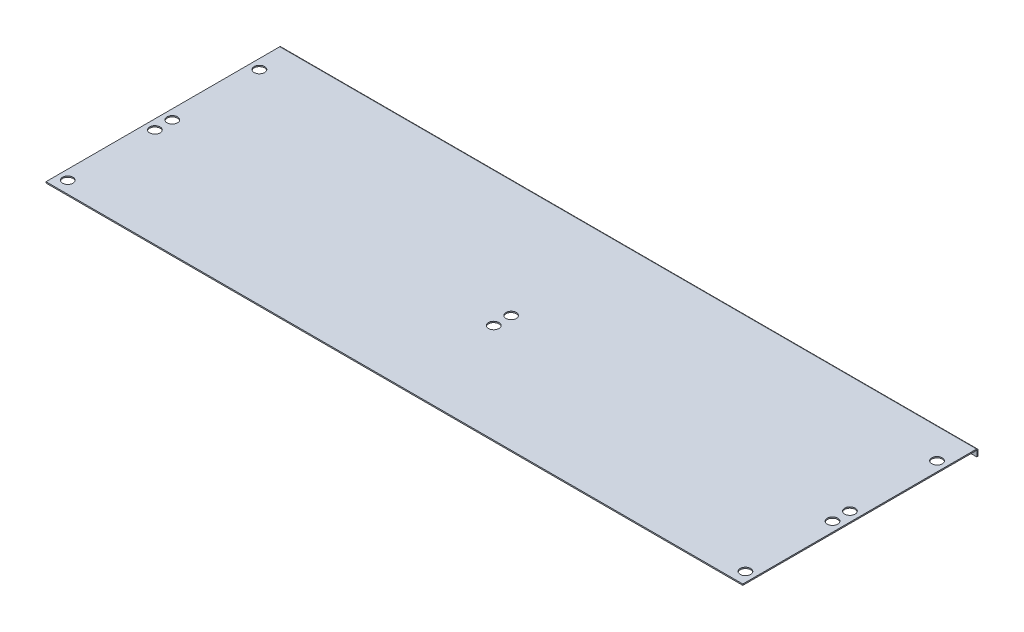
ISO-10303-21;
HEADER;
FILE_DESCRIPTION(('STEP AP214'),'2;1');
FILE_NAME('part.step','',(''),(''),'','','');
FILE_SCHEMA(('AUTOMOTIVE_DESIGN { 1 0 10303 214 1 1 1 1 }'));
ENDSEC;
DATA;
#1=APPLICATION_CONTEXT('core data for automotive mechanical design processes');
#2=APPLICATION_PROTOCOL_DEFINITION('international standard','automotive_design',2000,#1);
#3=PRODUCT_CONTEXT('',#1,'mechanical');
#4=PRODUCT('Part','Part','',(#3));
#5=PRODUCT_RELATED_PRODUCT_CATEGORY('part','',(#4));
#6=PRODUCT_DEFINITION_FORMATION('','',#4);
#7=PRODUCT_DEFINITION_CONTEXT('part definition',#1,'design');
#8=PRODUCT_DEFINITION('design','',#6,#7);
#9=PRODUCT_DEFINITION_SHAPE('','',#8);
#10=(LENGTH_UNIT() NAMED_UNIT(*) SI_UNIT(.MILLI.,.METRE.));
#11=(NAMED_UNIT(*) PLANE_ANGLE_UNIT() SI_UNIT($,.RADIAN.));
#12=(NAMED_UNIT(*) SI_UNIT($,.STERADIAN.) SOLID_ANGLE_UNIT());
#13=UNCERTAINTY_MEASURE_WITH_UNIT(LENGTH_MEASURE(1.E-05),#10,'distance_accuracy_value','');
#14=(GEOMETRIC_REPRESENTATION_CONTEXT(3) GLOBAL_UNCERTAINTY_ASSIGNED_CONTEXT((#13)) GLOBAL_UNIT_ASSIGNED_CONTEXT((#10,
#11,#12)) REPRESENTATION_CONTEXT('',''));
#15=CARTESIAN_POINT('',(0.,0.,0.));
#16=DIRECTION('',(0.,0.,1.));
#17=DIRECTION('',(1.,0.,0.));
#18=AXIS2_PLACEMENT_3D('',#15,#16,#17);
#19=CARTESIAN_POINT('',(200.,-0.7,-67.5));
#20=DIRECTION('',(1.,0.,0.));
#21=DIRECTION('',(0.,0.,-1.));
#22=AXIS2_PLACEMENT_3D('',#19,#20,#21);
#23=PLANE('',#22);
#24=DIRECTION('',(0.,0.,-1.));
#25=VECTOR('',#24,1.);
#26=CARTESIAN_POINT('',(200.,-0.7,-67.5));
#27=LINE('',#26,#25);
#28=CARTESIAN_POINT('',(200.,-0.7,67.5));
#29=VERTEX_POINT('',#28);
#30=CARTESIAN_POINT('',(200.,-0.700000000000008,-66.6));
#31=VERTEX_POINT('',#30);
#32=EDGE_CURVE('E111',#29,#31,#27,.T.);
#33=ORIENTED_EDGE('',*,*,#32,.T.);
#34=DIRECTION('',(0.,1.,0.));
#35=VECTOR('',#34,1.);
#36=CARTESIAN_POINT('',(200.,-0.700000000000008,-66.6));
#37=LINE('',#36,#35);
#38=CARTESIAN_POINT('',(200.,0.,-66.6));
#39=VERTEX_POINT('',#38);
#40=EDGE_CURVE('E102',#31,#39,#37,.T.);
#41=ORIENTED_EDGE('',*,*,#40,.T.);
#42=DIRECTION('',(0.,0.,-1.));
#43=VECTOR('',#42,1.);
#44=CARTESIAN_POINT('',(200.,0.,-67.5));
#45=LINE('',#44,#43);
#46=CARTESIAN_POINT('',(200.,0.,67.5));
#47=VERTEX_POINT('',#46);
#48=EDGE_CURVE('E100',#47,#39,#45,.T.);
#49=ORIENTED_EDGE('',*,*,#48,.F.);
#50=DIRECTION('',(0.,1.,0.));
#51=VECTOR('',#50,1.);
#52=CARTESIAN_POINT('',(200.,-0.7,67.5));
#53=LINE('',#52,#51);
#54=EDGE_CURVE('E13',#29,#47,#53,.T.);
#55=ORIENTED_EDGE('',*,*,#54,.F.);
#56=EDGE_LOOP('',(#33,#41,#49,#55));
#57=FACE_BOUND('',#56,.T.);
#58=ADVANCED_FACE('F58',(#57),#23,.T.);
#59=CARTESIAN_POINT('',(0.,-0.7,0.));
#60=DIRECTION('',(0.,1.,0.));
#61=DIRECTION('',(0.,0.,1.));
#62=AXIS2_PLACEMENT_3D('',#59,#60,#61);
#63=PLANE('',#62);
#64=CARTESIAN_POINT('',(-194.5,-0.7,60.5));
#65=DIRECTION('',(0.,1.,0.));
#66=DIRECTION('',(0.,0.,1.));
#67=AXIS2_PLACEMENT_3D('',#64,#65,#66);
#68=CIRCLE('',#67,2.99999999999999);
#69=CARTESIAN_POINT('',(-194.5,-0.7,63.5));
#70=VERTEX_POINT('',#69);
#71=EDGE_CURVE('E106',#70,#70,#68,.T.);
#72=ORIENTED_EDGE('',*,*,#71,.T.);
#73=EDGE_LOOP('',(#72));
#74=FACE_BOUND('',#73,.T.);
#75=CARTESIAN_POINT('',(-194.5,-0.7,10.5));
#76=DIRECTION('',(0.,1.,0.));
#77=DIRECTION('',(0.,0.,1.));
#78=AXIS2_PLACEMENT_3D('',#75,#76,#77);
#79=CIRCLE('',#78,2.99999999999999);
#80=CARTESIAN_POINT('',(-194.5,-0.7,13.5));
#81=VERTEX_POINT('',#80);
#82=EDGE_CURVE('E122',#81,#81,#79,.T.);
#83=ORIENTED_EDGE('',*,*,#82,.T.);
#84=EDGE_LOOP('',(#83));
#85=FACE_BOUND('',#84,.T.);
#86=CARTESIAN_POINT('',(-194.5,-0.7,0.500000000000002));
#87=DIRECTION('',(0.,1.,0.));
#88=DIRECTION('',(0.,0.,1.));
#89=AXIS2_PLACEMENT_3D('',#86,#87,#88);
#90=CIRCLE('',#89,2.99999999999999);
#91=CARTESIAN_POINT('',(-194.5,-0.7,3.5));
#92=VERTEX_POINT('',#91);
#93=EDGE_CURVE('E128',#92,#92,#90,.T.);
#94=ORIENTED_EDGE('',*,*,#93,.T.);
#95=EDGE_LOOP('',(#94));
#96=FACE_BOUND('',#95,.T.);
#97=CARTESIAN_POINT('',(-194.5,-0.7,-49.5));
#98=DIRECTION('',(0.,1.,0.));
#99=DIRECTION('',(0.,0.,1.));
#100=AXIS2_PLACEMENT_3D('',#97,#98,#99);
#101=CIRCLE('',#100,2.99999999999999);
#102=CARTESIAN_POINT('',(-194.5,-0.7,-46.5));
#103=VERTEX_POINT('',#102);
#104=EDGE_CURVE('E134',#103,#103,#101,.T.);
#105=ORIENTED_EDGE('',*,*,#104,.T.);
#106=EDGE_LOOP('',(#105));
#107=FACE_BOUND('',#106,.T.);
#108=CARTESIAN_POINT('',(194.5,-0.7,60.5));
#109=DIRECTION('',(0.,1.,0.));
#110=DIRECTION('',(0.,0.,-1.));
#111=AXIS2_PLACEMENT_3D('',#108,#109,#110);
#112=CIRCLE('',#111,2.99999999999999);
#113=CARTESIAN_POINT('',(194.5,-0.7,57.5));
#114=VERTEX_POINT('',#113);
#115=EDGE_CURVE('E140',#114,#114,#112,.T.);
#116=ORIENTED_EDGE('',*,*,#115,.T.);
#117=EDGE_LOOP('',(#116));
#118=FACE_BOUND('',#117,.T.);
#119=CARTESIAN_POINT('',(194.5,-0.7,10.5));
#120=DIRECTION('',(0.,1.,0.));
#121=DIRECTION('',(0.,0.,-1.));
#122=AXIS2_PLACEMENT_3D('',#119,#120,#121);
#123=CIRCLE('',#122,2.99999999999999);
#124=CARTESIAN_POINT('',(194.5,-0.7,7.49999999999996));
#125=VERTEX_POINT('',#124);
#126=EDGE_CURVE('E146',#125,#125,#123,.T.);
#127=ORIENTED_EDGE('',*,*,#126,.T.);
#128=EDGE_LOOP('',(#127));
#129=FACE_BOUND('',#128,.T.);
#130=CARTESIAN_POINT('',(194.5,-0.7,0.499999999999955));
#131=DIRECTION('',(0.,1.,0.));
#132=DIRECTION('',(0.,0.,-1.));
#133=AXIS2_PLACEMENT_3D('',#130,#131,#132);
#134=CIRCLE('',#133,2.99999999999999);
#135=CARTESIAN_POINT('',(194.5,-0.7,-2.50000000000004));
#136=VERTEX_POINT('',#135);
#137=EDGE_CURVE('E152',#136,#136,#134,.T.);
#138=ORIENTED_EDGE('',*,*,#137,.T.);
#139=EDGE_LOOP('',(#138));
#140=FACE_BOUND('',#139,.T.);
#141=CARTESIAN_POINT('',(194.5,-0.7,-49.5));
#142=DIRECTION('',(0.,1.,0.));
#143=DIRECTION('',(0.,0.,-1.));
#144=AXIS2_PLACEMENT_3D('',#141,#142,#143);
#145=CIRCLE('',#144,2.99999999999999);
#146=CARTESIAN_POINT('',(194.5,-0.7,-52.5));
#147=VERTEX_POINT('',#146);
#148=EDGE_CURVE('E158',#147,#147,#145,.T.);
#149=ORIENTED_EDGE('',*,*,#148,.T.);
#150=EDGE_LOOP('',(#149));
#151=FACE_BOUND('',#150,.T.);
#152=CARTESIAN_POINT('',(0.,-0.7,10.5));
#153=DIRECTION('',(0.,1.,0.));
#154=DIRECTION('',(0.,0.,1.));
#155=AXIS2_PLACEMENT_3D('',#152,#153,#154);
#156=CIRCLE('',#155,3.);
#157=CARTESIAN_POINT('',(0.,-0.7,13.5));
#158=VERTEX_POINT('',#157);
#159=EDGE_CURVE('E164',#158,#158,#156,.T.);
#160=ORIENTED_EDGE('',*,*,#159,.T.);
#161=EDGE_LOOP('',(#160));
#162=FACE_BOUND('',#161,.T.);
#163=CARTESIAN_POINT('',(0.,-0.7,0.500000000000002));
#164=DIRECTION('',(0.,1.,0.));
#165=DIRECTION('',(0.,0.,1.));
#166=AXIS2_PLACEMENT_3D('',#163,#164,#165);
#167=CIRCLE('',#166,3.);
#168=CARTESIAN_POINT('',(0.,-0.7,3.5));
#169=VERTEX_POINT('',#168);
#170=EDGE_CURVE('E170',#169,#169,#167,.T.);
#171=ORIENTED_EDGE('',*,*,#170,.T.);
#172=EDGE_LOOP('',(#171));
#173=FACE_BOUND('',#172,.T.);
#174=DIRECTION('',(1.,0.,0.));
#175=VECTOR('',#174,1.);
#176=CARTESIAN_POINT('',(200.,-0.700000000000008,-66.6));
#177=LINE('',#176,#175);
#178=CARTESIAN_POINT('',(-200.,-0.700000000000008,-66.6));
#179=VERTEX_POINT('',#178);
#180=EDGE_CURVE('E184',#31,#179,#177,.F.);
#181=ORIENTED_EDGE('',*,*,#180,.F.);
#182=ORIENTED_EDGE('',*,*,#32,.F.);
#183=DIRECTION('',(1.,0.,0.));
#184=VECTOR('',#183,1.);
#185=CARTESIAN_POINT('',(-200.,-0.7,67.5));
#186=LINE('',#185,#184);
#187=CARTESIAN_POINT('',(-200.,-0.7,67.5));
#188=VERTEX_POINT('',#187);
#189=EDGE_CURVE('E97',#188,#29,#186,.T.);
#190=ORIENTED_EDGE('',*,*,#189,.F.);
#191=DIRECTION('',(0.,0.,1.));
#192=VECTOR('',#191,1.);
#193=CARTESIAN_POINT('',(-200.,-0.7,-67.5));
#194=LINE('',#193,#192);
#195=EDGE_CURVE('E113',#179,#188,#194,.T.);
#196=ORIENTED_EDGE('',*,*,#195,.F.);
#197=EDGE_LOOP('',(#181,#182,#190,#196));
#198=FACE_BOUND('',#197,.T.);
#199=ADVANCED_FACE('F288',(#74,#85,#96,#107,#118,#129,#140,#151,#162,#173,#198),#63,.F.);
#200=CARTESIAN_POINT('',(0.,0.,0.));
#201=DIRECTION('',(0.,1.,0.));
#202=DIRECTION('',(0.,0.,1.));
#203=AXIS2_PLACEMENT_3D('',#200,#201,#202);
#204=PLANE('',#203);
#205=CARTESIAN_POINT('',(0.,0.,0.500000000000002));
#206=DIRECTION('',(0.,1.,0.));
#207=DIRECTION('',(0.,0.,1.));
#208=AXIS2_PLACEMENT_3D('',#205,#206,#207);
#209=CIRCLE('',#208,3.);
#210=CARTESIAN_POINT('',(0.,0.,3.5));
#211=VERTEX_POINT('',#210);
#212=EDGE_CURVE('E173',#211,#211,#209,.T.);
#213=ORIENTED_EDGE('',*,*,#212,.F.);
#214=EDGE_LOOP('',(#213));
#215=FACE_BOUND('',#214,.T.);
#216=CARTESIAN_POINT('',(0.,0.,10.5));
#217=DIRECTION('',(0.,1.,0.));
#218=DIRECTION('',(0.,0.,1.));
#219=AXIS2_PLACEMENT_3D('',#216,#217,#218);
#220=CIRCLE('',#219,3.);
#221=CARTESIAN_POINT('',(0.,0.,13.5));
#222=VERTEX_POINT('',#221);
#223=EDGE_CURVE('E167',#222,#222,#220,.T.);
#224=ORIENTED_EDGE('',*,*,#223,.F.);
#225=EDGE_LOOP('',(#224));
#226=FACE_BOUND('',#225,.T.);
#227=CARTESIAN_POINT('',(194.5,0.,-49.5));
#228=DIRECTION('',(0.,1.,0.));
#229=DIRECTION('',(0.,0.,-1.));
#230=AXIS2_PLACEMENT_3D('',#227,#228,#229);
#231=CIRCLE('',#230,2.99999999999999);
#232=CARTESIAN_POINT('',(194.5,0.,-52.5));
#233=VERTEX_POINT('',#232);
#234=EDGE_CURVE('E161',#233,#233,#231,.T.);
#235=ORIENTED_EDGE('',*,*,#234,.F.);
#236=EDGE_LOOP('',(#235));
#237=FACE_BOUND('',#236,.T.);
#238=CARTESIAN_POINT('',(194.5,0.,0.499999999999955));
#239=DIRECTION('',(0.,1.,0.));
#240=DIRECTION('',(0.,0.,-1.));
#241=AXIS2_PLACEMENT_3D('',#238,#239,#240);
#242=CIRCLE('',#241,2.99999999999999);
#243=CARTESIAN_POINT('',(194.5,0.,-2.50000000000004));
#244=VERTEX_POINT('',#243);
#245=EDGE_CURVE('E155',#244,#244,#242,.T.);
#246=ORIENTED_EDGE('',*,*,#245,.F.);
#247=EDGE_LOOP('',(#246));
#248=FACE_BOUND('',#247,.T.);
#249=CARTESIAN_POINT('',(194.5,0.,10.5));
#250=DIRECTION('',(0.,1.,0.));
#251=DIRECTION('',(0.,0.,-1.));
#252=AXIS2_PLACEMENT_3D('',#249,#250,#251);
#253=CIRCLE('',#252,2.99999999999999);
#254=CARTESIAN_POINT('',(194.5,0.,7.49999999999996));
#255=VERTEX_POINT('',#254);
#256=EDGE_CURVE('E149',#255,#255,#253,.T.);
#257=ORIENTED_EDGE('',*,*,#256,.F.);
#258=EDGE_LOOP('',(#257));
#259=FACE_BOUND('',#258,.T.);
#260=CARTESIAN_POINT('',(194.5,0.,60.5));
#261=DIRECTION('',(0.,1.,0.));
#262=DIRECTION('',(0.,0.,-1.));
#263=AXIS2_PLACEMENT_3D('',#260,#261,#262);
#264=CIRCLE('',#263,2.99999999999999);
#265=CARTESIAN_POINT('',(194.5,0.,57.5));
#266=VERTEX_POINT('',#265);
#267=EDGE_CURVE('E143',#266,#266,#264,.T.);
#268=ORIENTED_EDGE('',*,*,#267,.F.);
#269=EDGE_LOOP('',(#268));
#270=FACE_BOUND('',#269,.T.);
#271=CARTESIAN_POINT('',(-194.5,0.,-49.5));
#272=DIRECTION('',(0.,1.,0.));
#273=DIRECTION('',(0.,0.,1.));
#274=AXIS2_PLACEMENT_3D('',#271,#272,#273);
#275=CIRCLE('',#274,2.99999999999999);
#276=CARTESIAN_POINT('',(-194.5,0.,-46.5));
#277=VERTEX_POINT('',#276);
#278=EDGE_CURVE('E137',#277,#277,#275,.T.);
#279=ORIENTED_EDGE('',*,*,#278,.F.);
#280=EDGE_LOOP('',(#279));
#281=FACE_BOUND('',#280,.T.);
#282=CARTESIAN_POINT('',(-194.5,0.,0.500000000000002));
#283=DIRECTION('',(0.,1.,0.));
#284=DIRECTION('',(0.,0.,1.));
#285=AXIS2_PLACEMENT_3D('',#282,#283,#284);
#286=CIRCLE('',#285,2.99999999999999);
#287=CARTESIAN_POINT('',(-194.5,0.,3.5));
#288=VERTEX_POINT('',#287);
#289=EDGE_CURVE('E131',#288,#288,#286,.T.);
#290=ORIENTED_EDGE('',*,*,#289,.F.);
#291=EDGE_LOOP('',(#290));
#292=FACE_BOUND('',#291,.T.);
#293=CARTESIAN_POINT('',(-194.5,0.,10.5));
#294=DIRECTION('',(0.,1.,0.));
#295=DIRECTION('',(0.,0.,1.));
#296=AXIS2_PLACEMENT_3D('',#293,#294,#295);
#297=CIRCLE('',#296,2.99999999999999);
#298=CARTESIAN_POINT('',(-194.5,0.,13.5));
#299=VERTEX_POINT('',#298);
#300=EDGE_CURVE('E125',#299,#299,#297,.T.);
#301=ORIENTED_EDGE('',*,*,#300,.F.);
#302=EDGE_LOOP('',(#301));
#303=FACE_BOUND('',#302,.T.);
#304=CARTESIAN_POINT('',(-194.5,0.,60.5));
#305=DIRECTION('',(0.,1.,0.));
#306=DIRECTION('',(0.,0.,1.));
#307=AXIS2_PLACEMENT_3D('',#304,#305,#306);
#308=CIRCLE('',#307,2.99999999999999);
#309=CARTESIAN_POINT('',(-194.5,0.,63.5));
#310=VERTEX_POINT('',#309);
#311=EDGE_CURVE('E119',#310,#310,#308,.T.);
#312=ORIENTED_EDGE('',*,*,#311,.F.);
#313=EDGE_LOOP('',(#312));
#314=FACE_BOUND('',#313,.T.);
#315=ORIENTED_EDGE('',*,*,#48,.T.);
#316=DIRECTION('',(1.,0.,0.));
#317=VECTOR('',#316,1.);
#318=CARTESIAN_POINT('',(200.,0.,-66.6));
#319=LINE('',#318,#317);
#320=CARTESIAN_POINT('',(-200.,0.,-66.6));
#321=VERTEX_POINT('',#320);
#322=EDGE_CURVE('E194',#39,#321,#319,.F.);
#323=ORIENTED_EDGE('',*,*,#322,.T.);
#324=DIRECTION('',(0.,0.,1.));
#325=VECTOR('',#324,1.);
#326=CARTESIAN_POINT('',(-200.,0.,-67.5));
#327=LINE('',#326,#325);
#328=CARTESIAN_POINT('',(-200.,0.,67.5));
#329=VERTEX_POINT('',#328);
#330=EDGE_CURVE('E105',#321,#329,#327,.T.);
#331=ORIENTED_EDGE('',*,*,#330,.T.);
#332=DIRECTION('',(1.,0.,0.));
#333=VECTOR('',#332,1.);
#334=CARTESIAN_POINT('',(-200.,0.,67.5));
#335=LINE('',#334,#333);
#336=EDGE_CURVE('E95',#329,#47,#335,.T.);
#337=ORIENTED_EDGE('',*,*,#336,.T.);
#338=EDGE_LOOP('',(#315,#323,#331,#337));
#339=FACE_BOUND('',#338,.T.);
#340=ADVANCED_FACE('F108',(#215,#226,#237,#248,#259,#270,#281,#292,#303,#314,#339),#204,.T.);
#341=CARTESIAN_POINT('',(-200.,-0.7,67.5));
#342=DIRECTION('',(0.,0.,1.));
#343=DIRECTION('',(1.,0.,0.));
#344=AXIS2_PLACEMENT_3D('',#341,#342,#343);
#345=PLANE('',#344);
#346=ORIENTED_EDGE('',*,*,#336,.F.);
#347=DIRECTION('',(0.,1.,0.));
#348=VECTOR('',#347,1.);
#349=CARTESIAN_POINT('',(-200.,-0.7,67.5));
#350=LINE('',#349,#348);
#351=EDGE_CURVE('E61',#188,#329,#350,.T.);
#352=ORIENTED_EDGE('',*,*,#351,.F.);
#353=ORIENTED_EDGE('',*,*,#189,.T.);
#354=ORIENTED_EDGE('',*,*,#54,.T.);
#355=EDGE_LOOP('',(#346,#352,#353,#354));
#356=FACE_BOUND('',#355,.T.);
#357=ADVANCED_FACE('F92',(#356),#345,.T.);
#358=CARTESIAN_POINT('',(-200.,-0.7,-67.5));
#359=DIRECTION('',(-1.,0.,0.));
#360=DIRECTION('',(0.,0.,1.));
#361=AXIS2_PLACEMENT_3D('',#358,#359,#360);
#362=PLANE('',#361);
#363=DIRECTION('',(0.,1.,0.));
#364=VECTOR('',#363,1.);
#365=CARTESIAN_POINT('',(-200.,-0.700000000000008,-66.6));
#366=LINE('',#365,#364);
#367=EDGE_CURVE('E176',#179,#321,#366,.T.);
#368=ORIENTED_EDGE('',*,*,#367,.F.);
#369=ORIENTED_EDGE('',*,*,#195,.T.);
#370=ORIENTED_EDGE('',*,*,#351,.T.);
#371=ORIENTED_EDGE('',*,*,#330,.F.);
#372=EDGE_LOOP('',(#368,#369,#370,#371));
#373=FACE_BOUND('',#372,.T.);
#374=ADVANCED_FACE('F286',(#373),#362,.T.);
#375=CARTESIAN_POINT('',(-194.5,-0.7,60.5));
#376=DIRECTION('',(0.,1.,0.));
#377=DIRECTION('',(0.,0.,1.));
#378=AXIS2_PLACEMENT_3D('',#375,#376,#377);
#379=CYLINDRICAL_SURFACE('',#378,2.99999999999999);
#380=ORIENTED_EDGE('',*,*,#71,.F.);
#381=EDGE_LOOP('',(#380));
#382=FACE_BOUND('',#381,.T.);
#383=ORIENTED_EDGE('',*,*,#311,.T.);
#384=EDGE_LOOP('',(#383));
#385=FACE_BOUND('',#384,.T.);
#386=ADVANCED_FACE('F300',(#382,#385),#379,.F.);
#387=CARTESIAN_POINT('',(-194.5,-0.7,10.5));
#388=DIRECTION('',(0.,1.,0.));
#389=DIRECTION('',(0.,0.,1.));
#390=AXIS2_PLACEMENT_3D('',#387,#388,#389);
#391=CYLINDRICAL_SURFACE('',#390,2.99999999999999);
#392=ORIENTED_EDGE('',*,*,#82,.F.);
#393=EDGE_LOOP('',(#392));
#394=FACE_BOUND('',#393,.T.);
#395=ORIENTED_EDGE('',*,*,#300,.T.);
#396=EDGE_LOOP('',(#395));
#397=FACE_BOUND('',#396,.T.);
#398=ADVANCED_FACE('F308',(#394,#397),#391,.F.);
#399=CARTESIAN_POINT('',(-194.5,-0.7,0.500000000000002));
#400=DIRECTION('',(0.,1.,0.));
#401=DIRECTION('',(0.,0.,1.));
#402=AXIS2_PLACEMENT_3D('',#399,#400,#401);
#403=CYLINDRICAL_SURFACE('',#402,2.99999999999999);
#404=ORIENTED_EDGE('',*,*,#93,.F.);
#405=EDGE_LOOP('',(#404));
#406=FACE_BOUND('',#405,.T.);
#407=ORIENTED_EDGE('',*,*,#289,.T.);
#408=EDGE_LOOP('',(#407));
#409=FACE_BOUND('',#408,.T.);
#410=ADVANCED_FACE('F313',(#406,#409),#403,.F.);
#411=CARTESIAN_POINT('',(-194.5,-0.7,-49.5));
#412=DIRECTION('',(0.,1.,0.));
#413=DIRECTION('',(0.,0.,1.));
#414=AXIS2_PLACEMENT_3D('',#411,#412,#413);
#415=CYLINDRICAL_SURFACE('',#414,2.99999999999999);
#416=ORIENTED_EDGE('',*,*,#104,.F.);
#417=EDGE_LOOP('',(#416));
#418=FACE_BOUND('',#417,.T.);
#419=ORIENTED_EDGE('',*,*,#278,.T.);
#420=EDGE_LOOP('',(#419));
#421=FACE_BOUND('',#420,.T.);
#422=ADVANCED_FACE('F322',(#418,#421),#415,.F.);
#423=CARTESIAN_POINT('',(194.5,-0.7,60.5));
#424=DIRECTION('',(0.,1.,0.));
#425=DIRECTION('',(0.,0.,1.));
#426=AXIS2_PLACEMENT_3D('',#423,#424,#425);
#427=CYLINDRICAL_SURFACE('',#426,2.99999999999999);
#428=ORIENTED_EDGE('',*,*,#115,.F.);
#429=EDGE_LOOP('',(#428));
#430=FACE_BOUND('',#429,.T.);
#431=ORIENTED_EDGE('',*,*,#267,.T.);
#432=EDGE_LOOP('',(#431));
#433=FACE_BOUND('',#432,.T.);
#434=ADVANCED_FACE('F330',(#430,#433),#427,.F.);
#435=CARTESIAN_POINT('',(194.5,-0.7,10.5));
#436=DIRECTION('',(0.,1.,0.));
#437=DIRECTION('',(0.,0.,1.));
#438=AXIS2_PLACEMENT_3D('',#435,#436,#437);
#439=CYLINDRICAL_SURFACE('',#438,2.99999999999999);
#440=ORIENTED_EDGE('',*,*,#126,.F.);
#441=EDGE_LOOP('',(#440));
#442=FACE_BOUND('',#441,.T.);
#443=ORIENTED_EDGE('',*,*,#256,.T.);
#444=EDGE_LOOP('',(#443));
#445=FACE_BOUND('',#444,.T.);
#446=ADVANCED_FACE('F334',(#442,#445),#439,.F.);
#447=CARTESIAN_POINT('',(194.5,-0.7,0.499999999999955));
#448=DIRECTION('',(0.,1.,0.));
#449=DIRECTION('',(0.,0.,1.));
#450=AXIS2_PLACEMENT_3D('',#447,#448,#449);
#451=CYLINDRICAL_SURFACE('',#450,2.99999999999999);
#452=ORIENTED_EDGE('',*,*,#137,.F.);
#453=EDGE_LOOP('',(#452));
#454=FACE_BOUND('',#453,.T.);
#455=ORIENTED_EDGE('',*,*,#245,.T.);
#456=EDGE_LOOP('',(#455));
#457=FACE_BOUND('',#456,.T.);
#458=ADVANCED_FACE('F338',(#454,#457),#451,.F.);
#459=CARTESIAN_POINT('',(194.5,-0.7,-49.5));
#460=DIRECTION('',(0.,1.,0.));
#461=DIRECTION('',(0.,0.,1.));
#462=AXIS2_PLACEMENT_3D('',#459,#460,#461);
#463=CYLINDRICAL_SURFACE('',#462,2.99999999999999);
#464=ORIENTED_EDGE('',*,*,#148,.F.);
#465=EDGE_LOOP('',(#464));
#466=FACE_BOUND('',#465,.T.);
#467=ORIENTED_EDGE('',*,*,#234,.T.);
#468=EDGE_LOOP('',(#467));
#469=FACE_BOUND('',#468,.T.);
#470=ADVANCED_FACE('F342',(#466,#469),#463,.F.);
#471=CARTESIAN_POINT('',(0.,-0.7,10.5));
#472=DIRECTION('',(0.,1.,0.));
#473=DIRECTION('',(0.,0.,1.));
#474=AXIS2_PLACEMENT_3D('',#471,#472,#473);
#475=CYLINDRICAL_SURFACE('',#474,3.);
#476=ORIENTED_EDGE('',*,*,#159,.F.);
#477=EDGE_LOOP('',(#476));
#478=FACE_BOUND('',#477,.T.);
#479=ORIENTED_EDGE('',*,*,#223,.T.);
#480=EDGE_LOOP('',(#479));
#481=FACE_BOUND('',#480,.T.);
#482=ADVANCED_FACE('F346',(#478,#481),#475,.F.);
#483=CARTESIAN_POINT('',(0.,-0.7,0.500000000000002));
#484=DIRECTION('',(0.,1.,0.));
#485=DIRECTION('',(0.,0.,1.));
#486=AXIS2_PLACEMENT_3D('',#483,#484,#485);
#487=CYLINDRICAL_SURFACE('',#486,3.);
#488=ORIENTED_EDGE('',*,*,#170,.F.);
#489=EDGE_LOOP('',(#488));
#490=FACE_BOUND('',#489,.T.);
#491=ORIENTED_EDGE('',*,*,#212,.T.);
#492=EDGE_LOOP('',(#491));
#493=FACE_BOUND('',#492,.T.);
#494=ADVANCED_FACE('F350',(#490,#493),#487,.F.);
#495=CARTESIAN_POINT('',(-200.,-0.900000000000013,-66.6));
#496=DIRECTION('',(-1.,0.,0.));
#497=DIRECTION('',(0.,0.,1.));
#498=AXIS2_PLACEMENT_3D('',#495,#496,#497);
#499=PLANE('',#498);
#500=DIRECTION('',(0.,0.,1.));
#501=VECTOR('',#500,1.);
#502=CARTESIAN_POINT('',(-200.,-0.900000000000007,-67.5));
#503=LINE('',#502,#501);
#504=CARTESIAN_POINT('',(-200.,-0.900000000000012,-66.8));
#505=VERTEX_POINT('',#504);
#506=CARTESIAN_POINT('',(-200.,-0.900000000000009,-67.5));
#507=VERTEX_POINT('',#506);
#508=EDGE_CURVE('E197',#505,#507,#503,.F.);
#509=ORIENTED_EDGE('',*,*,#508,.F.);
#510=CARTESIAN_POINT('',(-200.,-0.900000000000013,-66.6));
#511=DIRECTION('',(1.,0.,0.));
#512=DIRECTION('',(0.,0.,-1.));
#513=AXIS2_PLACEMENT_3D('',#510,#511,#512);
#514=CIRCLE('',#513,0.200000000000006);
#515=EDGE_CURVE('E188',#179,#505,#514,.F.);
#516=ORIENTED_EDGE('',*,*,#515,.F.);
#517=ORIENTED_EDGE('',*,*,#367,.T.);
#518=CARTESIAN_POINT('',(-200.,-0.900000000000013,-66.6));
#519=DIRECTION('',(1.,0.,0.));
#520=DIRECTION('',(0.,0.,-1.));
#521=AXIS2_PLACEMENT_3D('',#518,#519,#520);
#522=CIRCLE('',#521,0.900000000000006);
#523=EDGE_CURVE('E72',#321,#507,#522,.F.);
#524=ORIENTED_EDGE('',*,*,#523,.T.);
#525=EDGE_LOOP('',(#509,#516,#517,#524));
#526=FACE_BOUND('',#525,.T.);
#527=ADVANCED_FACE('F282',(#526),#499,.T.);
#528=CARTESIAN_POINT('',(200.,-0.900000000000013,-66.6));
#529=DIRECTION('',(-1.,0.,0.));
#530=DIRECTION('',(0.,0.,1.));
#531=AXIS2_PLACEMENT_3D('',#528,#529,#530);
#532=PLANE('',#531);
#533=CARTESIAN_POINT('',(200.,-0.900000000000013,-66.6));
#534=DIRECTION('',(1.,0.,0.));
#535=DIRECTION('',(0.,0.,-1.));
#536=AXIS2_PLACEMENT_3D('',#533,#534,#535);
#537=CIRCLE('',#536,0.200000000000006);
#538=CARTESIAN_POINT('',(200.,-0.900000000000012,-66.8));
#539=VERTEX_POINT('',#538);
#540=EDGE_CURVE('E181',#539,#31,#537,.T.);
#541=ORIENTED_EDGE('',*,*,#540,.F.);
#542=DIRECTION('',(0.,0.,1.));
#543=VECTOR('',#542,1.);
#544=CARTESIAN_POINT('',(200.,-0.900000000000012,-66.8));
#545=LINE('',#544,#543);
#546=CARTESIAN_POINT('',(200.,-0.900000000000007,-67.5));
#547=VERTEX_POINT('',#546);
#548=EDGE_CURVE('E203',#539,#547,#545,.F.);
#549=ORIENTED_EDGE('',*,*,#548,.T.);
#550=CARTESIAN_POINT('',(200.,-0.900000000000013,-66.6));
#551=DIRECTION('',(1.,0.,0.));
#552=DIRECTION('',(0.,0.,-1.));
#553=AXIS2_PLACEMENT_3D('',#550,#551,#552);
#554=CIRCLE('',#553,0.900000000000006);
#555=EDGE_CURVE('E191',#547,#39,#554,.T.);
#556=ORIENTED_EDGE('',*,*,#555,.T.);
#557=ORIENTED_EDGE('',*,*,#40,.F.);
#558=EDGE_LOOP('',(#541,#549,#556,#557));
#559=FACE_BOUND('',#558,.T.);
#560=ADVANCED_FACE('F274',(#559),#532,.F.);
#561=CARTESIAN_POINT('',(200.,-0.900000000000013,-66.6));
#562=DIRECTION('',(1.,0.,0.));
#563=DIRECTION('',(0.,0.,-1.));
#564=AXIS2_PLACEMENT_3D('',#561,#562,#563);
#565=CYLINDRICAL_SURFACE('',#564,0.900000000000006);
#566=ORIENTED_EDGE('',*,*,#322,.F.);
#567=ORIENTED_EDGE('',*,*,#555,.F.);
#568=DIRECTION('',(1.,0.,0.));
#569=VECTOR('',#568,1.);
#570=CARTESIAN_POINT('',(-200.,-0.900000000000007,-67.5));
#571=LINE('',#570,#569);
#572=EDGE_CURVE('E206',#547,#507,#571,.F.);
#573=ORIENTED_EDGE('',*,*,#572,.T.);
#574=ORIENTED_EDGE('',*,*,#523,.F.);
#575=EDGE_LOOP('',(#566,#567,#573,#574));
#576=FACE_BOUND('',#575,.T.);
#577=ADVANCED_FACE('F280',(#576),#565,.T.);
#578=CARTESIAN_POINT('',(200.,-0.900000000000013,-66.6));
#579=DIRECTION('',(1.,0.,0.));
#580=DIRECTION('',(0.,0.,-1.));
#581=AXIS2_PLACEMENT_3D('',#578,#579,#580);
#582=CYLINDRICAL_SURFACE('',#581,0.200000000000006);
#583=ORIENTED_EDGE('',*,*,#180,.T.);
#584=ORIENTED_EDGE('',*,*,#515,.T.);
#585=DIRECTION('',(1.,0.,0.));
#586=VECTOR('',#585,1.);
#587=CARTESIAN_POINT('',(-200.,-0.900000000000012,-66.8));
#588=LINE('',#587,#586);
#589=EDGE_CURVE('E200',#505,#539,#588,.T.);
#590=ORIENTED_EDGE('',*,*,#589,.T.);
#591=ORIENTED_EDGE('',*,*,#540,.T.);
#592=EDGE_LOOP('',(#583,#584,#590,#591));
#593=FACE_BOUND('',#592,.T.);
#594=ADVANCED_FACE('F268',(#593),#582,.F.);
#595=CARTESIAN_POINT('',(200.,-4.,-67.5));
#596=DIRECTION('',(-1.,0.,0.));
#597=DIRECTION('',(0.,0.,1.));
#598=AXIS2_PLACEMENT_3D('',#595,#596,#597);
#599=PLANE('',#598);
#600=ORIENTED_EDGE('',*,*,#548,.F.);
#601=DIRECTION('',(0.,1.,0.));
#602=VECTOR('',#601,1.);
#603=CARTESIAN_POINT('',(200.,-4.,-66.8));
#604=LINE('',#603,#602);
#605=CARTESIAN_POINT('',(200.,-4.,-66.8));
#606=VERTEX_POINT('',#605);
#607=EDGE_CURVE('E208',#539,#606,#604,.F.);
#608=ORIENTED_EDGE('',*,*,#607,.T.);
#609=DIRECTION('',(0.,0.,1.));
#610=VECTOR('',#609,1.);
#611=CARTESIAN_POINT('',(200.,-4.,-67.5));
#612=LINE('',#611,#610);
#613=CARTESIAN_POINT('',(200.,-4.,-67.5));
#614=VERTEX_POINT('',#613);
#615=EDGE_CURVE('E185',#614,#606,#612,.T.);
#616=ORIENTED_EDGE('',*,*,#615,.F.);
#617=DIRECTION('',(0.,-1.,0.));
#618=VECTOR('',#617,1.);
#619=CARTESIAN_POINT('',(200.,2.86307878460668E-13,-67.5));
#620=LINE('',#619,#618);
#621=EDGE_CURVE('E217',#547,#614,#620,.T.);
#622=ORIENTED_EDGE('',*,*,#621,.F.);
#623=EDGE_LOOP('',(#600,#608,#616,#622));
#624=FACE_BOUND('',#623,.T.);
#625=ADVANCED_FACE('F244',(#624),#599,.F.);
#626=CARTESIAN_POINT('',(-200.,-0.699999999999998,-67.5));
#627=DIRECTION('',(1.,0.,0.));
#628=DIRECTION('',(0.,0.,-1.));
#629=AXIS2_PLACEMENT_3D('',#626,#627,#628);
#630=PLANE('',#629);
#631=ORIENTED_EDGE('',*,*,#508,.T.);
#632=DIRECTION('',(0.,1.,0.));
#633=VECTOR('',#632,1.);
#634=CARTESIAN_POINT('',(-200.,2.86307878460668E-13,-67.5));
#635=LINE('',#634,#633);
#636=CARTESIAN_POINT('',(-200.,-4.,-67.5));
#637=VERTEX_POINT('',#636);
#638=EDGE_CURVE('E223',#637,#507,#635,.T.);
#639=ORIENTED_EDGE('',*,*,#638,.F.);
#640=DIRECTION('',(0.,0.,1.));
#641=VECTOR('',#640,1.);
#642=CARTESIAN_POINT('',(-200.,-4.,-67.5));
#643=LINE('',#642,#641);
#644=CARTESIAN_POINT('',(-200.,-4.,-66.8));
#645=VERTEX_POINT('',#644);
#646=EDGE_CURVE('E226',#637,#645,#643,.T.);
#647=ORIENTED_EDGE('',*,*,#646,.T.);
#648=DIRECTION('',(0.,-1.,0.));
#649=VECTOR('',#648,1.);
#650=CARTESIAN_POINT('',(-200.,-0.7,-66.8));
#651=LINE('',#650,#649);
#652=EDGE_CURVE('E214',#645,#505,#651,.F.);
#653=ORIENTED_EDGE('',*,*,#652,.T.);
#654=EDGE_LOOP('',(#631,#639,#647,#653));
#655=FACE_BOUND('',#654,.T.);
#656=ADVANCED_FACE('F277',(#655),#630,.F.);
#657=CARTESIAN_POINT('',(0.,2.86307878460668E-13,-67.5));
#658=DIRECTION('',(0.,0.,1.));
#659=DIRECTION('',(0.,-1.,0.));
#660=AXIS2_PLACEMENT_3D('',#657,#658,#659);
#661=PLANE('',#660);
#662=ORIENTED_EDGE('',*,*,#572,.F.);
#663=ORIENTED_EDGE('',*,*,#621,.T.);
#664=DIRECTION('',(-1.,0.,0.));
#665=VECTOR('',#664,1.);
#666=CARTESIAN_POINT('',(0.,-4.,-67.5));
#667=LINE('',#666,#665);
#668=EDGE_CURVE('E220',#614,#637,#667,.T.);
#669=ORIENTED_EDGE('',*,*,#668,.T.);
#670=ORIENTED_EDGE('',*,*,#638,.T.);
#671=EDGE_LOOP('',(#662,#663,#669,#670));
#672=FACE_BOUND('',#671,.T.);
#673=ADVANCED_FACE('F279',(#672),#661,.F.);
#674=CARTESIAN_POINT('',(0.,2.83863841523477E-13,-66.8));
#675=DIRECTION('',(0.,0.,1.));
#676=DIRECTION('',(0.,-1.,0.));
#677=AXIS2_PLACEMENT_3D('',#674,#675,#676);
#678=PLANE('',#677);
#679=ORIENTED_EDGE('',*,*,#607,.F.);
#680=ORIENTED_EDGE('',*,*,#589,.F.);
#681=ORIENTED_EDGE('',*,*,#652,.F.);
#682=DIRECTION('',(1.,0.,0.));
#683=VECTOR('',#682,1.);
#684=CARTESIAN_POINT('',(-200.,-4.,-66.8));
#685=LINE('',#684,#683);
#686=EDGE_CURVE('E211',#606,#645,#685,.F.);
#687=ORIENTED_EDGE('',*,*,#686,.F.);
#688=EDGE_LOOP('',(#679,#680,#681,#687));
#689=FACE_BOUND('',#688,.T.);
#690=ADVANCED_FACE('F275',(#689),#678,.T.);
#691=CARTESIAN_POINT('',(-200.,-4.,-67.5));
#692=DIRECTION('',(0.,1.,0.));
#693=DIRECTION('',(0.,0.,1.));
#694=AXIS2_PLACEMENT_3D('',#691,#692,#693);
#695=PLANE('',#694);
#696=ORIENTED_EDGE('',*,*,#686,.T.);
#697=ORIENTED_EDGE('',*,*,#646,.F.);
#698=ORIENTED_EDGE('',*,*,#668,.F.);
#699=ORIENTED_EDGE('',*,*,#615,.T.);
#700=EDGE_LOOP('',(#696,#697,#698,#699));
#701=FACE_BOUND('',#700,.T.);
#702=ADVANCED_FACE('F234',(#701),#695,.F.);
#703=CLOSED_SHELL('',(#58,#199,#340,#357,#374,#386,#398,#410,#422,#434,#446,#458,#470,#482,#494,
#527,#560,#577,#594,#625,#656,#673,#690,#702));
#704=MANIFOLD_SOLID_BREP('B2',#703);
#705=ADVANCED_BREP_SHAPE_REPRESENTATION('',(#18,#704),#14);
#706=SHAPE_DEFINITION_REPRESENTATION(#9,#705);
ENDSEC;
END-ISO-10303-21;
